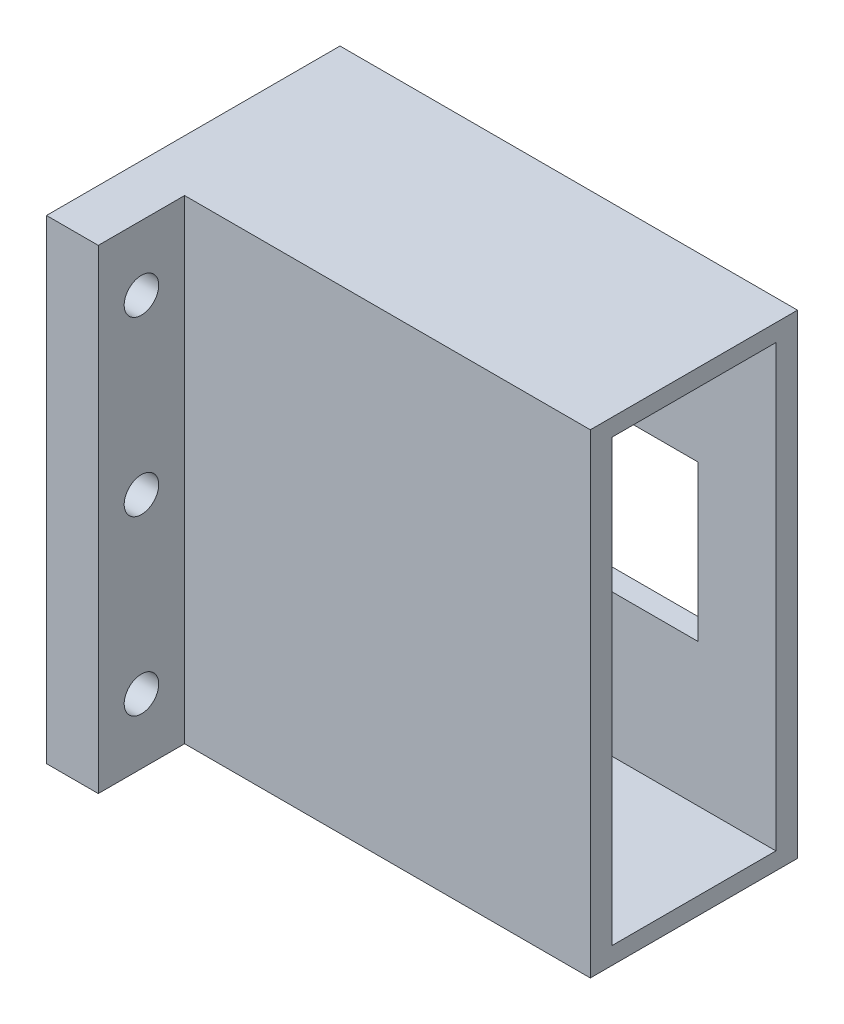
ISO-10303-21;
HEADER;
FILE_DESCRIPTION(('STEP AP214'),'2;1');
FILE_NAME('part.step','',(''),(''),'','','');
FILE_SCHEMA(('AUTOMOTIVE_DESIGN { 1 0 10303 214 1 1 1 1 }'));
ENDSEC;
DATA;
#1=APPLICATION_CONTEXT('core data for automotive mechanical design processes');
#2=APPLICATION_PROTOCOL_DEFINITION('international standard','automotive_design',2000,#1);
#3=PRODUCT_CONTEXT('',#1,'mechanical');
#4=PRODUCT('Part','Part','',(#3));
#5=PRODUCT_RELATED_PRODUCT_CATEGORY('part','',(#4));
#6=PRODUCT_DEFINITION_FORMATION('','',#4);
#7=PRODUCT_DEFINITION_CONTEXT('part definition',#1,'design');
#8=PRODUCT_DEFINITION('design','',#6,#7);
#9=PRODUCT_DEFINITION_SHAPE('','',#8);
#10=(LENGTH_UNIT() NAMED_UNIT(*) SI_UNIT(.MILLI.,.METRE.));
#11=(NAMED_UNIT(*) PLANE_ANGLE_UNIT() SI_UNIT($,.RADIAN.));
#12=(NAMED_UNIT(*) SI_UNIT($,.STERADIAN.) SOLID_ANGLE_UNIT());
#13=UNCERTAINTY_MEASURE_WITH_UNIT(LENGTH_MEASURE(1.E-05),#10,'distance_accuracy_value','');
#14=(GEOMETRIC_REPRESENTATION_CONTEXT(3) GLOBAL_UNCERTAINTY_ASSIGNED_CONTEXT((#13)) GLOBAL_UNIT_ASSIGNED_CONTEXT((#10,
#11,#12)) REPRESENTATION_CONTEXT('',''));
#15=CARTESIAN_POINT('',(0.,0.,0.));
#16=DIRECTION('',(0.,0.,1.));
#17=DIRECTION('',(1.,0.,0.));
#18=AXIS2_PLACEMENT_3D('',#15,#16,#17);
#19=CARTESIAN_POINT('',(0.,0.,12.));
#20=DIRECTION('',(0.,0.,-1.));
#21=DIRECTION('',(-1.,0.,0.));
#22=AXIS2_PLACEMENT_3D('',#19,#20,#21);
#23=PLANE('',#22);
#24=DIRECTION('',(0.,1.,0.));
#25=VECTOR('',#24,1.);
#26=CARTESIAN_POINT('',(-10.25,13.75,12.));
#27=LINE('',#26,#25);
#28=CARTESIAN_POINT('',(-10.25,-13.75,12.));
#29=VERTEX_POINT('',#28);
#30=CARTESIAN_POINT('',(-10.25,13.75,12.));
#31=VERTEX_POINT('',#30);
#32=EDGE_CURVE('E60',#29,#31,#27,.T.);
#33=ORIENTED_EDGE('',*,*,#32,.F.);
#34=DIRECTION('',(1.,0.,0.));
#35=VECTOR('',#34,1.);
#36=CARTESIAN_POINT('',(-13.25,-13.75,12.));
#37=LINE('',#36,#35);
#38=CARTESIAN_POINT('',(13.25,-13.75,12.));
#39=VERTEX_POINT('',#38);
#40=EDGE_CURVE('E242',#29,#39,#37,.T.);
#41=ORIENTED_EDGE('',*,*,#40,.T.);
#42=DIRECTION('',(0.,1.,0.));
#43=VECTOR('',#42,1.);
#44=CARTESIAN_POINT('',(13.25,-13.75,12.));
#45=LINE('',#44,#43);
#46=CARTESIAN_POINT('',(13.25,13.75,12.));
#47=VERTEX_POINT('',#46);
#48=EDGE_CURVE('E236',#39,#47,#45,.T.);
#49=ORIENTED_EDGE('',*,*,#48,.T.);
#50=DIRECTION('',(-1.,0.,0.));
#51=VECTOR('',#50,1.);
#52=CARTESIAN_POINT('',(-13.25,13.75,12.));
#53=LINE('',#52,#51);
#54=EDGE_CURVE('E239',#47,#31,#53,.T.);
#55=ORIENTED_EDGE('',*,*,#54,.T.);
#56=EDGE_LOOP('',(#33,#41,#49,#55));
#57=FACE_BOUND('',#56,.T.);
#58=ADVANCED_FACE('F45',(#57),#23,.F.);
#59=CARTESIAN_POINT('',(13.25,-13.75,12.));
#60=DIRECTION('',(-1.,0.,0.));
#61=DIRECTION('',(0.,0.,1.));
#62=AXIS2_PLACEMENT_3D('',#59,#60,#61);
#63=PLANE('',#62);
#64=DIRECTION('',(0.,0.,1.));
#65=VECTOR('',#64,1.);
#66=CARTESIAN_POINT('',(13.25,12.75,10.75));
#67=LINE('',#66,#65);
#68=CARTESIAN_POINT('',(13.25,12.75,1.24999999999999));
#69=VERTEX_POINT('',#68);
#70=CARTESIAN_POINT('',(13.25,12.75,10.75));
#71=VERTEX_POINT('',#70);
#72=EDGE_CURVE('E219',#69,#71,#67,.T.);
#73=ORIENTED_EDGE('',*,*,#72,.F.);
#74=DIRECTION('',(0.,1.,0.));
#75=VECTOR('',#74,1.);
#76=CARTESIAN_POINT('',(13.25,-12.75,1.24999999999999));
#77=LINE('',#76,#75);
#78=CARTESIAN_POINT('',(13.25,-12.75,1.24999999999999));
#79=VERTEX_POINT('',#78);
#80=EDGE_CURVE('E198',#79,#69,#77,.T.);
#81=ORIENTED_EDGE('',*,*,#80,.F.);
#82=DIRECTION('',(0.,0.,-1.));
#83=VECTOR('',#82,1.);
#84=CARTESIAN_POINT('',(13.25,-12.75,10.75));
#85=LINE('',#84,#83);
#86=CARTESIAN_POINT('',(13.25,-12.75,10.75));
#87=VERTEX_POINT('',#86);
#88=EDGE_CURVE('E208',#87,#79,#85,.T.);
#89=ORIENTED_EDGE('',*,*,#88,.F.);
#90=DIRECTION('',(0.,-1.,0.));
#91=VECTOR('',#90,1.);
#92=CARTESIAN_POINT('',(13.25,-12.75,10.75));
#93=LINE('',#92,#91);
#94=EDGE_CURVE('E222',#71,#87,#93,.T.);
#95=ORIENTED_EDGE('',*,*,#94,.F.);
#96=EDGE_LOOP('',(#73,#81,#89,#95));
#97=FACE_BOUND('',#96,.T.);
#98=DIRECTION('',(0.,1.,0.));
#99=VECTOR('',#98,1.);
#100=CARTESIAN_POINT('',(13.25,-13.75,0.));
#101=LINE('',#100,#99);
#102=CARTESIAN_POINT('',(13.25,-13.75,0.));
#103=VERTEX_POINT('',#102);
#104=CARTESIAN_POINT('',(13.25,13.75,0.));
#105=VERTEX_POINT('',#104);
#106=EDGE_CURVE('E229',#103,#105,#101,.T.);
#107=ORIENTED_EDGE('',*,*,#106,.T.);
#108=DIRECTION('',(0.,0.,-1.));
#109=VECTOR('',#108,1.);
#110=CARTESIAN_POINT('',(13.25,13.75,12.));
#111=LINE('',#110,#109);
#112=EDGE_CURVE('E253',#47,#105,#111,.T.);
#113=ORIENTED_EDGE('',*,*,#112,.F.);
#114=ORIENTED_EDGE('',*,*,#48,.F.);
#115=DIRECTION('',(0.,0.,-1.));
#116=VECTOR('',#115,1.);
#117=CARTESIAN_POINT('',(13.25,-13.75,12.));
#118=LINE('',#117,#116);
#119=EDGE_CURVE('E158',#39,#103,#118,.T.);
#120=ORIENTED_EDGE('',*,*,#119,.T.);
#121=EDGE_LOOP('',(#107,#113,#114,#120));
#122=FACE_BOUND('',#121,.T.);
#123=ADVANCED_FACE('F47',(#97,#122),#63,.F.);
#124=CARTESIAN_POINT('',(-13.25,13.75,12.));
#125=DIRECTION('',(0.,-1.,0.));
#126=DIRECTION('',(0.,0.,-1.));
#127=AXIS2_PLACEMENT_3D('',#124,#125,#126);
#128=PLANE('',#127);
#129=DIRECTION('',(-1.,0.,0.));
#130=VECTOR('',#129,1.);
#131=CARTESIAN_POINT('',(-13.25,13.75,0.));
#132=LINE('',#131,#130);
#133=CARTESIAN_POINT('',(-13.25,13.75,0.));
#134=VERTEX_POINT('',#133);
#135=EDGE_CURVE('E246',#105,#134,#132,.T.);
#136=ORIENTED_EDGE('',*,*,#135,.T.);
#137=DIRECTION('',(0.,0.,-1.));
#138=VECTOR('',#137,1.);
#139=CARTESIAN_POINT('',(-13.25,13.75,12.));
#140=LINE('',#139,#138);
#141=CARTESIAN_POINT('',(-13.25,13.75,17.));
#142=VERTEX_POINT('',#141);
#143=EDGE_CURVE('E157',#142,#134,#140,.T.);
#144=ORIENTED_EDGE('',*,*,#143,.F.);
#145=DIRECTION('',(-1.,0.,0.));
#146=VECTOR('',#145,1.);
#147=CARTESIAN_POINT('',(-13.25,13.75,17.));
#148=LINE('',#147,#146);
#149=CARTESIAN_POINT('',(-10.25,13.75,17.));
#150=VERTEX_POINT('',#149);
#151=EDGE_CURVE('E172',#150,#142,#148,.T.);
#152=ORIENTED_EDGE('',*,*,#151,.F.);
#153=DIRECTION('',(0.,0.,-1.));
#154=VECTOR('',#153,1.);
#155=CARTESIAN_POINT('',(-10.25,13.75,17.));
#156=LINE('',#155,#154);
#157=EDGE_CURVE('E180',#150,#31,#156,.T.);
#158=ORIENTED_EDGE('',*,*,#157,.T.);
#159=ORIENTED_EDGE('',*,*,#54,.F.);
#160=ORIENTED_EDGE('',*,*,#112,.T.);
#161=EDGE_LOOP('',(#136,#144,#152,#158,#159,#160));
#162=FACE_BOUND('',#161,.T.);
#163=ADVANCED_FACE('F301',(#162),#128,.F.);
#164=CARTESIAN_POINT('',(-13.25,-13.75,12.));
#165=DIRECTION('',(1.,0.,0.));
#166=DIRECTION('',(0.,0.,-1.));
#167=AXIS2_PLACEMENT_3D('',#164,#165,#166);
#168=PLANE('',#167);
#169=CARTESIAN_POINT('',(-13.25,-10.,14.5));
#170=DIRECTION('',(1.,0.,0.));
#171=DIRECTION('',(0.,0.,-1.));
#172=AXIS2_PLACEMENT_3D('',#169,#170,#171);
#173=CIRCLE('',#172,0.999999999999999);
#174=CARTESIAN_POINT('',(-13.25,-10.,13.5));
#175=VERTEX_POINT('',#174);
#176=EDGE_CURVE('E174',#175,#175,#173,.T.);
#177=ORIENTED_EDGE('',*,*,#176,.T.);
#178=EDGE_LOOP('',(#177));
#179=FACE_BOUND('',#178,.T.);
#180=CARTESIAN_POINT('',(-13.25,0.,14.5));
#181=DIRECTION('',(1.,0.,0.));
#182=DIRECTION('',(0.,0.,-1.));
#183=AXIS2_PLACEMENT_3D('',#180,#181,#182);
#184=CIRCLE('',#183,1.);
#185=CARTESIAN_POINT('',(-13.25,0.,13.5));
#186=VERTEX_POINT('',#185);
#187=EDGE_CURVE('E420',#186,#186,#184,.T.);
#188=ORIENTED_EDGE('',*,*,#187,.T.);
#189=EDGE_LOOP('',(#188));
#190=FACE_BOUND('',#189,.T.);
#191=CARTESIAN_POINT('',(-13.25,10.,14.5));
#192=DIRECTION('',(1.,0.,0.));
#193=DIRECTION('',(0.,0.,-1.));
#194=AXIS2_PLACEMENT_3D('',#191,#192,#193);
#195=CIRCLE('',#194,0.999999999999999);
#196=CARTESIAN_POINT('',(-13.25,10.,13.5));
#197=VERTEX_POINT('',#196);
#198=EDGE_CURVE('E422',#197,#197,#195,.T.);
#199=ORIENTED_EDGE('',*,*,#198,.T.);
#200=EDGE_LOOP('',(#199));
#201=FACE_BOUND('',#200,.T.);
#202=DIRECTION('',(0.,-1.,0.));
#203=VECTOR('',#202,1.);
#204=CARTESIAN_POINT('',(-13.25,-13.75,0.));
#205=LINE('',#204,#203);
#206=CARTESIAN_POINT('',(-13.25,-13.75,0.));
#207=VERTEX_POINT('',#206);
#208=EDGE_CURVE('E154',#134,#207,#205,.T.);
#209=ORIENTED_EDGE('',*,*,#208,.T.);
#210=DIRECTION('',(0.,0.,-1.));
#211=VECTOR('',#210,1.);
#212=CARTESIAN_POINT('',(-13.25,-13.75,12.));
#213=LINE('',#212,#211);
#214=CARTESIAN_POINT('',(-13.25,-13.75,17.));
#215=VERTEX_POINT('',#214);
#216=EDGE_CURVE('E147',#215,#207,#213,.T.);
#217=ORIENTED_EDGE('',*,*,#216,.F.);
#218=DIRECTION('',(0.,-1.,0.));
#219=VECTOR('',#218,1.);
#220=CARTESIAN_POINT('',(-13.25,13.75,17.));
#221=LINE('',#220,#219);
#222=EDGE_CURVE('E152',#142,#215,#221,.T.);
#223=ORIENTED_EDGE('',*,*,#222,.F.);
#224=ORIENTED_EDGE('',*,*,#143,.T.);
#225=EDGE_LOOP('',(#209,#217,#223,#224));
#226=FACE_BOUND('',#225,.T.);
#227=ADVANCED_FACE('F149',(#179,#190,#201,#226),#168,.F.);
#228=CARTESIAN_POINT('',(-13.25,-13.75,12.));
#229=DIRECTION('',(0.,1.,0.));
#230=DIRECTION('',(0.,0.,1.));
#231=AXIS2_PLACEMENT_3D('',#228,#229,#230);
#232=PLANE('',#231);
#233=DIRECTION('',(1.,0.,0.));
#234=VECTOR('',#233,1.);
#235=CARTESIAN_POINT('',(-13.25,-13.75,0.));
#236=LINE('',#235,#234);
#237=EDGE_CURVE('E240',#207,#103,#236,.T.);
#238=ORIENTED_EDGE('',*,*,#237,.T.);
#239=ORIENTED_EDGE('',*,*,#119,.F.);
#240=ORIENTED_EDGE('',*,*,#40,.F.);
#241=DIRECTION('',(0.,0.,-1.));
#242=VECTOR('',#241,1.);
#243=CARTESIAN_POINT('',(-10.25,-13.75,17.));
#244=LINE('',#243,#242);
#245=CARTESIAN_POINT('',(-10.25,-13.75,17.));
#246=VERTEX_POINT('',#245);
#247=EDGE_CURVE('E164',#246,#29,#244,.T.);
#248=ORIENTED_EDGE('',*,*,#247,.F.);
#249=DIRECTION('',(1.,0.,0.));
#250=VECTOR('',#249,1.);
#251=CARTESIAN_POINT('',(-13.25,-13.75,17.));
#252=LINE('',#251,#250);
#253=EDGE_CURVE('E161',#215,#246,#252,.T.);
#254=ORIENTED_EDGE('',*,*,#253,.F.);
#255=ORIENTED_EDGE('',*,*,#216,.T.);
#256=EDGE_LOOP('',(#238,#239,#240,#248,#254,#255));
#257=FACE_BOUND('',#256,.T.);
#258=ADVANCED_FACE('F162',(#257),#232,.F.);
#259=CARTESIAN_POINT('',(0.,0.,0.));
#260=DIRECTION('',(0.,0.,-1.));
#261=DIRECTION('',(-1.,0.,0.));
#262=AXIS2_PLACEMENT_3D('',#259,#260,#261);
#263=PLANE('',#262);
#264=DIRECTION('',(0.,-1.,0.));
#265=VECTOR('',#264,1.);
#266=CARTESIAN_POINT('',(8.75,-4.5,0.));
#267=LINE('',#266,#265);
#268=CARTESIAN_POINT('',(8.75,4.5,0.));
#269=VERTEX_POINT('',#268);
#270=CARTESIAN_POINT('',(8.75,-4.5,0.));
#271=VERTEX_POINT('',#270);
#272=EDGE_CURVE('E68',#269,#271,#267,.T.);
#273=ORIENTED_EDGE('',*,*,#272,.F.);
#274=DIRECTION('',(1.,0.,0.));
#275=VECTOR('',#274,1.);
#276=CARTESIAN_POINT('',(-0.249999999999997,4.5,0.));
#277=LINE('',#276,#275);
#278=CARTESIAN_POINT('',(-0.249999999999997,4.5,0.));
#279=VERTEX_POINT('',#278);
#280=EDGE_CURVE('E192',#279,#269,#277,.T.);
#281=ORIENTED_EDGE('',*,*,#280,.F.);
#282=DIRECTION('',(0.,1.,0.));
#283=VECTOR('',#282,1.);
#284=CARTESIAN_POINT('',(-0.249999999999997,-4.5,0.));
#285=LINE('',#284,#283);
#286=CARTESIAN_POINT('',(-0.249999999999997,-4.5,0.));
#287=VERTEX_POINT('',#286);
#288=EDGE_CURVE('E189',#287,#279,#285,.T.);
#289=ORIENTED_EDGE('',*,*,#288,.F.);
#290=DIRECTION('',(-1.,0.,0.));
#291=VECTOR('',#290,1.);
#292=CARTESIAN_POINT('',(-0.249999999999997,-4.5,0.));
#293=LINE('',#292,#291);
#294=EDGE_CURVE('E186',#271,#287,#293,.T.);
#295=ORIENTED_EDGE('',*,*,#294,.F.);
#296=EDGE_LOOP('',(#273,#281,#289,#295));
#297=FACE_BOUND('',#296,.T.);
#298=ORIENTED_EDGE('',*,*,#106,.F.);
#299=ORIENTED_EDGE('',*,*,#237,.F.);
#300=ORIENTED_EDGE('',*,*,#208,.F.);
#301=ORIENTED_EDGE('',*,*,#135,.F.);
#302=EDGE_LOOP('',(#298,#299,#300,#301));
#303=FACE_BOUND('',#302,.T.);
#304=ADVANCED_FACE('F276',(#297,#303),#263,.T.);
#305=CARTESIAN_POINT('',(-11.25,-12.75,1.24999999999999));
#306=DIRECTION('',(0.,0.,-1.));
#307=DIRECTION('',(-1.,0.,0.));
#308=AXIS2_PLACEMENT_3D('',#305,#306,#307);
#309=PLANE('',#308);
#310=DIRECTION('',(1.,0.,0.));
#311=VECTOR('',#310,1.);
#312=CARTESIAN_POINT('',(-11.25,4.50000000000001,1.24999999999999));
#313=LINE('',#312,#311);
#314=CARTESIAN_POINT('',(-0.249999999999997,4.5,1.24999999999999));
#315=VERTEX_POINT('',#314);
#316=CARTESIAN_POINT('',(8.75,4.5,1.24999999999999));
#317=VERTEX_POINT('',#316);
#318=EDGE_CURVE('E53',#315,#317,#313,.T.);
#319=ORIENTED_EDGE('',*,*,#318,.T.);
#320=DIRECTION('',(0.,-1.,0.));
#321=VECTOR('',#320,1.);
#322=CARTESIAN_POINT('',(8.75,-12.75,1.24999999999999));
#323=LINE('',#322,#321);
#324=CARTESIAN_POINT('',(8.75,-4.5,1.24999999999999));
#325=VERTEX_POINT('',#324);
#326=EDGE_CURVE('E11',#317,#325,#323,.T.);
#327=ORIENTED_EDGE('',*,*,#326,.T.);
#328=DIRECTION('',(-1.,0.,0.));
#329=VECTOR('',#328,1.);
#330=CARTESIAN_POINT('',(-11.25,-4.5,1.24999999999999));
#331=LINE('',#330,#329);
#332=CARTESIAN_POINT('',(-0.249999999999997,-4.5,1.24999999999999));
#333=VERTEX_POINT('',#332);
#334=EDGE_CURVE('E256',#325,#333,#331,.T.);
#335=ORIENTED_EDGE('',*,*,#334,.T.);
#336=DIRECTION('',(0.,1.,0.));
#337=VECTOR('',#336,1.);
#338=CARTESIAN_POINT('',(-0.249999999999997,-12.75,1.24999999999999));
#339=LINE('',#338,#337);
#340=EDGE_CURVE('E259',#333,#315,#339,.T.);
#341=ORIENTED_EDGE('',*,*,#340,.T.);
#342=EDGE_LOOP('',(#319,#327,#335,#341));
#343=FACE_BOUND('',#342,.T.);
#344=ORIENTED_EDGE('',*,*,#80,.T.);
#345=DIRECTION('',(1.,0.,0.));
#346=VECTOR('',#345,1.);
#347=CARTESIAN_POINT('',(-11.25,12.75,1.24999999999999));
#348=LINE('',#347,#346);
#349=CARTESIAN_POINT('',(-11.25,12.75,1.24999999999999));
#350=VERTEX_POINT('',#349);
#351=EDGE_CURVE('E217',#350,#69,#348,.T.);
#352=ORIENTED_EDGE('',*,*,#351,.F.);
#353=DIRECTION('',(0.,1.,0.));
#354=VECTOR('',#353,1.);
#355=CARTESIAN_POINT('',(-11.25,-12.75,1.24999999999999));
#356=LINE('',#355,#354);
#357=CARTESIAN_POINT('',(-11.25,-12.75,1.24999999999999));
#358=VERTEX_POINT('',#357);
#359=EDGE_CURVE('E204',#358,#350,#356,.T.);
#360=ORIENTED_EDGE('',*,*,#359,.F.);
#361=DIRECTION('',(1.,0.,0.));
#362=VECTOR('',#361,1.);
#363=CARTESIAN_POINT('',(-11.25,-12.75,1.24999999999999));
#364=LINE('',#363,#362);
#365=EDGE_CURVE('E227',#358,#79,#364,.T.);
#366=ORIENTED_EDGE('',*,*,#365,.T.);
#367=EDGE_LOOP('',(#344,#352,#360,#366));
#368=FACE_BOUND('',#367,.T.);
#369=ADVANCED_FACE('F263',(#343,#368),#309,.F.);
#370=CARTESIAN_POINT('',(-11.25,-12.75,10.75));
#371=DIRECTION('',(0.,-1.,0.));
#372=DIRECTION('',(0.,0.,-1.));
#373=AXIS2_PLACEMENT_3D('',#370,#371,#372);
#374=PLANE('',#373);
#375=ORIENTED_EDGE('',*,*,#88,.T.);
#376=ORIENTED_EDGE('',*,*,#365,.F.);
#377=DIRECTION('',(0.,0.,-1.));
#378=VECTOR('',#377,1.);
#379=CARTESIAN_POINT('',(-11.25,-12.75,10.75));
#380=LINE('',#379,#378);
#381=CARTESIAN_POINT('',(-11.25,-12.75,10.75));
#382=VERTEX_POINT('',#381);
#383=EDGE_CURVE('E214',#382,#358,#380,.T.);
#384=ORIENTED_EDGE('',*,*,#383,.F.);
#385=DIRECTION('',(1.,0.,0.));
#386=VECTOR('',#385,1.);
#387=CARTESIAN_POINT('',(-11.25,-12.75,10.75));
#388=LINE('',#387,#386);
#389=EDGE_CURVE('E230',#382,#87,#388,.T.);
#390=ORIENTED_EDGE('',*,*,#389,.T.);
#391=EDGE_LOOP('',(#375,#376,#384,#390));
#392=FACE_BOUND('',#391,.T.);
#393=ADVANCED_FACE('F452',(#392),#374,.F.);
#394=CARTESIAN_POINT('',(-11.25,-12.75,10.75));
#395=DIRECTION('',(0.,0.,1.));
#396=DIRECTION('',(1.,0.,0.));
#397=AXIS2_PLACEMENT_3D('',#394,#395,#396);
#398=PLANE('',#397);
#399=ORIENTED_EDGE('',*,*,#94,.T.);
#400=ORIENTED_EDGE('',*,*,#389,.F.);
#401=DIRECTION('',(0.,-1.,0.));
#402=VECTOR('',#401,1.);
#403=CARTESIAN_POINT('',(-11.25,-12.75,10.75));
#404=LINE('',#403,#402);
#405=CARTESIAN_POINT('',(-11.25,12.75,10.75));
#406=VERTEX_POINT('',#405);
#407=EDGE_CURVE('E211',#406,#382,#404,.T.);
#408=ORIENTED_EDGE('',*,*,#407,.F.);
#409=DIRECTION('',(1.,0.,0.));
#410=VECTOR('',#409,1.);
#411=CARTESIAN_POINT('',(-11.25,12.75,10.75));
#412=LINE('',#411,#410);
#413=EDGE_CURVE('E232',#406,#71,#412,.T.);
#414=ORIENTED_EDGE('',*,*,#413,.T.);
#415=EDGE_LOOP('',(#399,#400,#408,#414));
#416=FACE_BOUND('',#415,.T.);
#417=ADVANCED_FACE('F460',(#416),#398,.F.);
#418=CARTESIAN_POINT('',(-11.25,12.75,10.75));
#419=DIRECTION('',(0.,1.,0.));
#420=DIRECTION('',(0.,0.,1.));
#421=AXIS2_PLACEMENT_3D('',#418,#419,#420);
#422=PLANE('',#421);
#423=ORIENTED_EDGE('',*,*,#72,.T.);
#424=ORIENTED_EDGE('',*,*,#413,.F.);
#425=DIRECTION('',(0.,0.,1.));
#426=VECTOR('',#425,1.);
#427=CARTESIAN_POINT('',(-11.25,12.75,10.75));
#428=LINE('',#427,#426);
#429=EDGE_CURVE('E207',#350,#406,#428,.T.);
#430=ORIENTED_EDGE('',*,*,#429,.F.);
#431=ORIENTED_EDGE('',*,*,#351,.T.);
#432=EDGE_LOOP('',(#423,#424,#430,#431));
#433=FACE_BOUND('',#432,.T.);
#434=ADVANCED_FACE('F290',(#433),#422,.F.);
#435=CARTESIAN_POINT('',(-11.25,0.,0.));
#436=DIRECTION('',(-1.,0.,0.));
#437=DIRECTION('',(0.,0.,1.));
#438=AXIS2_PLACEMENT_3D('',#435,#436,#437);
#439=PLANE('',#438);
#440=ORIENTED_EDGE('',*,*,#359,.T.);
#441=ORIENTED_EDGE('',*,*,#429,.T.);
#442=ORIENTED_EDGE('',*,*,#407,.T.);
#443=ORIENTED_EDGE('',*,*,#383,.T.);
#444=EDGE_LOOP('',(#440,#441,#442,#443));
#445=FACE_BOUND('',#444,.T.);
#446=ADVANCED_FACE('F282',(#445),#439,.F.);
#447=CARTESIAN_POINT('',(8.75,-4.5,3.5));
#448=DIRECTION('',(1.,0.,0.));
#449=DIRECTION('',(0.,0.,-1.));
#450=AXIS2_PLACEMENT_3D('',#447,#448,#449);
#451=PLANE('',#450);
#452=DIRECTION('',(0.,0.,-1.));
#453=VECTOR('',#452,1.);
#454=CARTESIAN_POINT('',(8.75,4.5,3.5));
#455=LINE('',#454,#453);
#456=EDGE_CURVE('E196',#317,#269,#455,.T.);
#457=ORIENTED_EDGE('',*,*,#456,.T.);
#458=ORIENTED_EDGE('',*,*,#272,.T.);
#459=DIRECTION('',(0.,0.,-1.));
#460=VECTOR('',#459,1.);
#461=CARTESIAN_POINT('',(8.75,-4.5,3.5));
#462=LINE('',#461,#460);
#463=EDGE_CURVE('E195',#325,#271,#462,.T.);
#464=ORIENTED_EDGE('',*,*,#463,.F.);
#465=ORIENTED_EDGE('',*,*,#326,.F.);
#466=EDGE_LOOP('',(#457,#458,#464,#465));
#467=FACE_BOUND('',#466,.T.);
#468=ADVANCED_FACE('F280',(#467),#451,.F.);
#469=CARTESIAN_POINT('',(-0.249999999999997,4.5,3.5));
#470=DIRECTION('',(0.,1.,0.));
#471=DIRECTION('',(-1.,0.,0.));
#472=AXIS2_PLACEMENT_3D('',#469,#470,#471);
#473=PLANE('',#472);
#474=DIRECTION('',(0.,0.,-1.));
#475=VECTOR('',#474,1.);
#476=CARTESIAN_POINT('',(-0.249999999999997,4.5,3.5));
#477=LINE('',#476,#475);
#478=EDGE_CURVE('E199',#315,#279,#477,.T.);
#479=ORIENTED_EDGE('',*,*,#478,.T.);
#480=ORIENTED_EDGE('',*,*,#280,.T.);
#481=ORIENTED_EDGE('',*,*,#456,.F.);
#482=ORIENTED_EDGE('',*,*,#318,.F.);
#483=EDGE_LOOP('',(#479,#480,#481,#482));
#484=FACE_BOUND('',#483,.T.);
#485=ADVANCED_FACE('F269',(#484),#473,.F.);
#486=CARTESIAN_POINT('',(-0.249999999999997,-4.5,3.5));
#487=DIRECTION('',(-1.,0.,0.));
#488=DIRECTION('',(0.,0.,1.));
#489=AXIS2_PLACEMENT_3D('',#486,#487,#488);
#490=PLANE('',#489);
#491=DIRECTION('',(0.,0.,-1.));
#492=VECTOR('',#491,1.);
#493=CARTESIAN_POINT('',(-0.249999999999997,-4.5,3.5));
#494=LINE('',#493,#492);
#495=EDGE_CURVE('E201',#333,#287,#494,.T.);
#496=ORIENTED_EDGE('',*,*,#495,.T.);
#497=ORIENTED_EDGE('',*,*,#288,.T.);
#498=ORIENTED_EDGE('',*,*,#478,.F.);
#499=ORIENTED_EDGE('',*,*,#340,.F.);
#500=EDGE_LOOP('',(#496,#497,#498,#499));
#501=FACE_BOUND('',#500,.T.);
#502=ADVANCED_FACE('F271',(#501),#490,.F.);
#503=CARTESIAN_POINT('',(-0.249999999999997,-4.5,3.5));
#504=DIRECTION('',(0.,-1.,0.));
#505=DIRECTION('',(1.,0.,0.));
#506=AXIS2_PLACEMENT_3D('',#503,#504,#505);
#507=PLANE('',#506);
#508=ORIENTED_EDGE('',*,*,#463,.T.);
#509=ORIENTED_EDGE('',*,*,#294,.T.);
#510=ORIENTED_EDGE('',*,*,#495,.F.);
#511=ORIENTED_EDGE('',*,*,#334,.F.);
#512=EDGE_LOOP('',(#508,#509,#510,#511));
#513=FACE_BOUND('',#512,.T.);
#514=ADVANCED_FACE('F279',(#513),#507,.F.);
#515=CARTESIAN_POINT('',(-10.25,13.75,17.));
#516=DIRECTION('',(-1.,0.,0.));
#517=DIRECTION('',(0.,-1.,0.));
#518=AXIS2_PLACEMENT_3D('',#515,#516,#517);
#519=PLANE('',#518);
#520=CARTESIAN_POINT('',(-10.25,-10.,14.5));
#521=DIRECTION('',(1.,0.,0.));
#522=DIRECTION('',(0.,1.,0.));
#523=AXIS2_PLACEMENT_3D('',#520,#521,#522);
#524=CIRCLE('',#523,0.999999999999999);
#525=CARTESIAN_POINT('',(-10.25,-9.,14.5));
#526=VERTEX_POINT('',#525);
#527=EDGE_CURVE('E417',#526,#526,#524,.T.);
#528=ORIENTED_EDGE('',*,*,#527,.F.);
#529=EDGE_LOOP('',(#528));
#530=FACE_BOUND('',#529,.T.);
#531=CARTESIAN_POINT('',(-10.25,0.,14.5));
#532=DIRECTION('',(1.,0.,0.));
#533=DIRECTION('',(0.,1.,0.));
#534=AXIS2_PLACEMENT_3D('',#531,#532,#533);
#535=CIRCLE('',#534,1.);
#536=CARTESIAN_POINT('',(-10.25,1.,14.5));
#537=VERTEX_POINT('',#536);
#538=EDGE_CURVE('E431',#537,#537,#535,.T.);
#539=ORIENTED_EDGE('',*,*,#538,.F.);
#540=EDGE_LOOP('',(#539));
#541=FACE_BOUND('',#540,.T.);
#542=CARTESIAN_POINT('',(-10.25,10.,14.5));
#543=DIRECTION('',(1.,0.,0.));
#544=DIRECTION('',(0.,1.,0.));
#545=AXIS2_PLACEMENT_3D('',#542,#543,#544);
#546=CIRCLE('',#545,0.999999999999999);
#547=CARTESIAN_POINT('',(-10.25,11.,14.5));
#548=VERTEX_POINT('',#547);
#549=EDGE_CURVE('E428',#548,#548,#546,.T.);
#550=ORIENTED_EDGE('',*,*,#549,.F.);
#551=EDGE_LOOP('',(#550));
#552=FACE_BOUND('',#551,.T.);
#553=ORIENTED_EDGE('',*,*,#32,.T.);
#554=ORIENTED_EDGE('',*,*,#157,.F.);
#555=DIRECTION('',(0.,1.,0.));
#556=VECTOR('',#555,1.);
#557=CARTESIAN_POINT('',(-10.25,13.75,17.));
#558=LINE('',#557,#556);
#559=EDGE_CURVE('E167',#246,#150,#558,.T.);
#560=ORIENTED_EDGE('',*,*,#559,.F.);
#561=ORIENTED_EDGE('',*,*,#247,.T.);
#562=EDGE_LOOP('',(#553,#554,#560,#561));
#563=FACE_BOUND('',#562,.T.);
#564=ADVANCED_FACE('F321',(#530,#541,#552,#563),#519,.F.);
#565=CARTESIAN_POINT('',(0.,0.,17.));
#566=DIRECTION('',(0.,0.,1.));
#567=DIRECTION('',(1.,0.,0.));
#568=AXIS2_PLACEMENT_3D('',#565,#566,#567);
#569=PLANE('',#568);
#570=ORIENTED_EDGE('',*,*,#222,.T.);
#571=ORIENTED_EDGE('',*,*,#253,.T.);
#572=ORIENTED_EDGE('',*,*,#559,.T.);
#573=ORIENTED_EDGE('',*,*,#151,.T.);
#574=EDGE_LOOP('',(#570,#571,#572,#573));
#575=FACE_BOUND('',#574,.T.);
#576=ADVANCED_FACE('F170',(#575),#569,.T.);
#577=CARTESIAN_POINT('',(-15.25,10.,14.5));
#578=DIRECTION('',(1.,0.,0.));
#579=DIRECTION('',(0.,1.,0.));
#580=AXIS2_PLACEMENT_3D('',#577,#578,#579);
#581=CYLINDRICAL_SURFACE('',#580,0.999999999999999);
#582=ORIENTED_EDGE('',*,*,#549,.T.);
#583=EDGE_LOOP('',(#582));
#584=FACE_BOUND('',#583,.T.);
#585=ORIENTED_EDGE('',*,*,#198,.F.);
#586=EDGE_LOOP('',(#585));
#587=FACE_BOUND('',#586,.T.);
#588=ADVANCED_FACE('F330',(#584,#587),#581,.F.);
#589=CARTESIAN_POINT('',(-15.25,0.,14.5));
#590=DIRECTION('',(1.,0.,0.));
#591=DIRECTION('',(0.,1.,0.));
#592=AXIS2_PLACEMENT_3D('',#589,#590,#591);
#593=CYLINDRICAL_SURFACE('',#592,1.);
#594=ORIENTED_EDGE('',*,*,#538,.T.);
#595=EDGE_LOOP('',(#594));
#596=FACE_BOUND('',#595,.T.);
#597=ORIENTED_EDGE('',*,*,#187,.F.);
#598=EDGE_LOOP('',(#597));
#599=FACE_BOUND('',#598,.T.);
#600=ADVANCED_FACE('F393',(#596,#599),#593,.F.);
#601=CARTESIAN_POINT('',(-15.25,-10.,14.5));
#602=DIRECTION('',(1.,0.,0.));
#603=DIRECTION('',(0.,1.,0.));
#604=AXIS2_PLACEMENT_3D('',#601,#602,#603);
#605=CYLINDRICAL_SURFACE('',#604,0.999999999999999);
#606=ORIENTED_EDGE('',*,*,#527,.T.);
#607=EDGE_LOOP('',(#606));
#608=FACE_BOUND('',#607,.T.);
#609=ORIENTED_EDGE('',*,*,#176,.F.);
#610=EDGE_LOOP('',(#609));
#611=FACE_BOUND('',#610,.T.);
#612=ADVANCED_FACE('F402',(#608,#611),#605,.F.);
#613=CLOSED_SHELL('',(#58,#123,#163,#227,#258,#304,#369,#393,#417,#434,#446,#468,#485,#502,#514,
#564,#576,#588,#600,#612));
#614=MANIFOLD_SOLID_BREP('B2',#613);
#615=ADVANCED_BREP_SHAPE_REPRESENTATION('',(#18,#614),#14);
#616=SHAPE_DEFINITION_REPRESENTATION(#9,#615);
ENDSEC;
END-ISO-10303-21;
